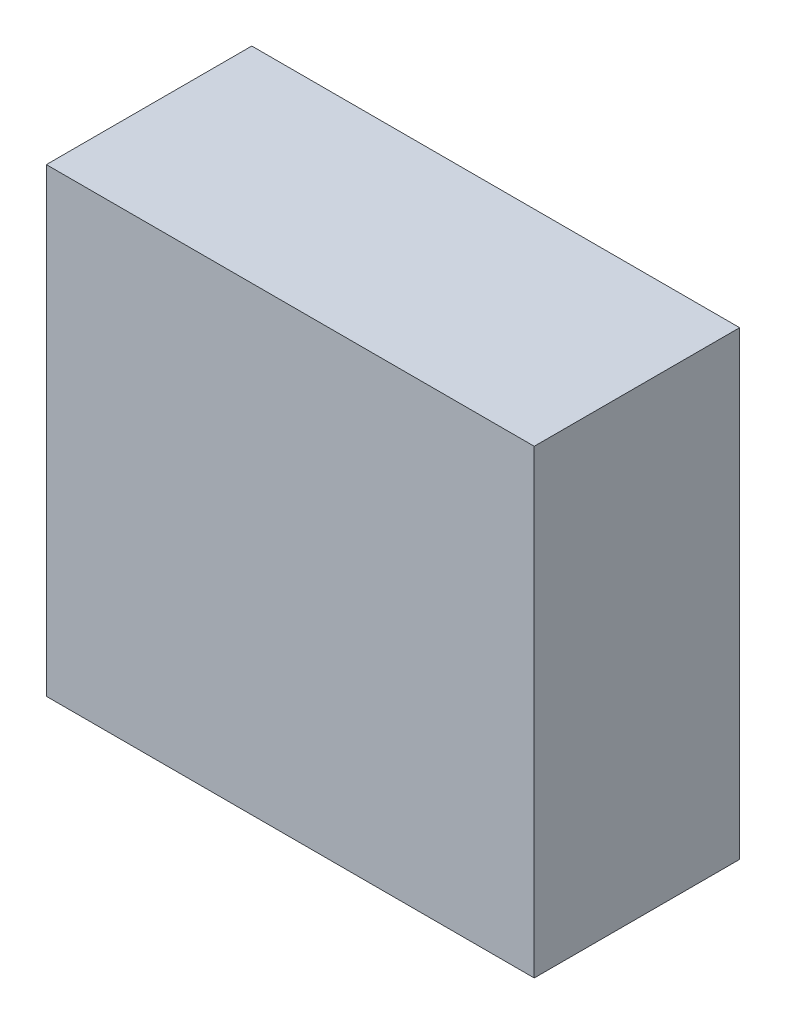
ISO-10303-21;
HEADER;
FILE_DESCRIPTION(('STEP AP214'),'2;1');
FILE_NAME('part.step','',(''),(''),'','','');
FILE_SCHEMA(('AUTOMOTIVE_DESIGN { 1 0 10303 214 1 1 1 1 }'));
ENDSEC;
DATA;
#1=APPLICATION_CONTEXT('core data for automotive mechanical design processes');
#2=APPLICATION_PROTOCOL_DEFINITION('international standard','automotive_design',2000,#1);
#3=PRODUCT_CONTEXT('',#1,'mechanical');
#4=PRODUCT('Part','Part','',(#3));
#5=PRODUCT_RELATED_PRODUCT_CATEGORY('part','',(#4));
#6=PRODUCT_DEFINITION_FORMATION('','',#4);
#7=PRODUCT_DEFINITION_CONTEXT('part definition',#1,'design');
#8=PRODUCT_DEFINITION('design','',#6,#7);
#9=PRODUCT_DEFINITION_SHAPE('','',#8);
#10=(LENGTH_UNIT() NAMED_UNIT(*) SI_UNIT(.MILLI.,.METRE.));
#11=(NAMED_UNIT(*) PLANE_ANGLE_UNIT() SI_UNIT($,.RADIAN.));
#12=(NAMED_UNIT(*) SI_UNIT($,.STERADIAN.) SOLID_ANGLE_UNIT());
#13=UNCERTAINTY_MEASURE_WITH_UNIT(LENGTH_MEASURE(1.E-05),#10,'distance_accuracy_value','');
#14=(GEOMETRIC_REPRESENTATION_CONTEXT(3) GLOBAL_UNCERTAINTY_ASSIGNED_CONTEXT((#13)) GLOBAL_UNIT_ASSIGNED_CONTEXT((#10,
#11,#12)) REPRESENTATION_CONTEXT('',''));
#15=CARTESIAN_POINT('',(0.,0.,0.));
#16=DIRECTION('',(0.,0.,1.));
#17=DIRECTION('',(1.,0.,0.));
#18=AXIS2_PLACEMENT_3D('',#15,#16,#17);
#19=CARTESIAN_POINT('',(-3.56249986,3.36250026,2.99999908));
#20=DIRECTION('',(0.,0.,1.));
#21=DIRECTION('',(1.,0.,0.));
#22=AXIS2_PLACEMENT_3D('',#19,#20,#21);
#23=PLANE('',#22);
#24=DIRECTION('',(0.,1.,0.));
#25=VECTOR('',#24,1.);
#26=CARTESIAN_POINT('',(-3.56249986,-3.36250026,2.99999908));
#27=LINE('',#26,#25);
#28=CARTESIAN_POINT('',(-3.56249986,-3.36250026,2.99999908));
#29=VERTEX_POINT('',#28);
#30=CARTESIAN_POINT('',(-3.56249986,3.36250026,2.99999908));
#31=VERTEX_POINT('',#30);
#32=EDGE_CURVE('E25',#29,#31,#27,.T.);
#33=ORIENTED_EDGE('',*,*,#32,.F.);
#34=DIRECTION('',(-1.,0.,0.));
#35=VECTOR('',#34,1.);
#36=CARTESIAN_POINT('',(3.56249986,-3.36250026,2.99999908));
#37=LINE('',#36,#35);
#38=CARTESIAN_POINT('',(3.56249986,-3.36250026,2.99999908));
#39=VERTEX_POINT('',#38);
#40=EDGE_CURVE('E102',#39,#29,#37,.T.);
#41=ORIENTED_EDGE('',*,*,#40,.F.);
#42=DIRECTION('',(0.,-1.,0.));
#43=VECTOR('',#42,1.);
#44=CARTESIAN_POINT('',(3.56249986,3.36250026,2.99999908));
#45=LINE('',#44,#43);
#46=CARTESIAN_POINT('',(3.56249986,3.36250026,2.99999908));
#47=VERTEX_POINT('',#46);
#48=EDGE_CURVE('E68',#47,#39,#45,.T.);
#49=ORIENTED_EDGE('',*,*,#48,.F.);
#50=DIRECTION('',(1.,0.,0.));
#51=VECTOR('',#50,1.);
#52=CARTESIAN_POINT('',(-3.56249986,3.36250026,2.99999908));
#53=LINE('',#52,#51);
#54=EDGE_CURVE('E94',#31,#47,#53,.T.);
#55=ORIENTED_EDGE('',*,*,#54,.F.);
#56=EDGE_LOOP('',(#33,#41,#49,#55));
#57=FACE_BOUND('',#56,.T.);
#58=ADVANCED_FACE('F17',(#57),#23,.T.);
#59=CARTESIAN_POINT('',(-3.56249986,3.36250026,0.));
#60=DIRECTION('',(0.,0.,1.));
#61=DIRECTION('',(1.,0.,0.));
#62=AXIS2_PLACEMENT_3D('',#59,#60,#61);
#63=PLANE('',#62);
#64=DIRECTION('',(1.,0.,0.));
#65=VECTOR('',#64,1.);
#66=CARTESIAN_POINT('',(-3.56249986,3.36250026,0.));
#67=LINE('',#66,#65);
#68=CARTESIAN_POINT('',(-3.56249986,3.36250026,0.));
#69=VERTEX_POINT('',#68);
#70=CARTESIAN_POINT('',(3.56249986,3.36250026,0.));
#71=VERTEX_POINT('',#70);
#72=EDGE_CURVE('E80',#69,#71,#67,.T.);
#73=ORIENTED_EDGE('',*,*,#72,.T.);
#74=DIRECTION('',(0.,-1.,0.));
#75=VECTOR('',#74,1.);
#76=CARTESIAN_POINT('',(3.56249986,3.36250026,0.));
#77=LINE('',#76,#75);
#78=CARTESIAN_POINT('',(3.56249986,-3.36250026,0.));
#79=VERTEX_POINT('',#78);
#80=EDGE_CURVE('E61',#71,#79,#77,.T.);
#81=ORIENTED_EDGE('',*,*,#80,.T.);
#82=DIRECTION('',(-1.,0.,0.));
#83=VECTOR('',#82,1.);
#84=CARTESIAN_POINT('',(3.56249986,-3.36250026,0.));
#85=LINE('',#84,#83);
#86=CARTESIAN_POINT('',(-3.56249986,-3.36250026,0.));
#87=VERTEX_POINT('',#86);
#88=EDGE_CURVE('E82',#79,#87,#85,.T.);
#89=ORIENTED_EDGE('',*,*,#88,.T.);
#90=DIRECTION('',(0.,1.,0.));
#91=VECTOR('',#90,1.);
#92=CARTESIAN_POINT('',(-3.56249986,-3.36250026,0.));
#93=LINE('',#92,#91);
#94=EDGE_CURVE('E11',#87,#69,#93,.T.);
#95=ORIENTED_EDGE('',*,*,#94,.T.);
#96=EDGE_LOOP('',(#73,#81,#89,#95));
#97=FACE_BOUND('',#96,.T.);
#98=ADVANCED_FACE('F79',(#97),#63,.F.);
#99=CARTESIAN_POINT('',(-3.56249986,-3.36250026,0.));
#100=DIRECTION('',(-1.,0.,0.));
#101=DIRECTION('',(0.,0.,1.));
#102=AXIS2_PLACEMENT_3D('',#99,#100,#101);
#103=PLANE('',#102);
#104=DIRECTION('',(0.,0.,1.));
#105=VECTOR('',#104,1.);
#106=CARTESIAN_POINT('',(-3.56249986,-3.36250026,0.));
#107=LINE('',#106,#105);
#108=EDGE_CURVE('E105',#87,#29,#107,.T.);
#109=ORIENTED_EDGE('',*,*,#108,.T.);
#110=ORIENTED_EDGE('',*,*,#32,.T.);
#111=DIRECTION('',(0.,0.,1.));
#112=VECTOR('',#111,1.);
#113=CARTESIAN_POINT('',(-3.56249986,3.36250026,0.));
#114=LINE('',#113,#112);
#115=EDGE_CURVE('E88',#69,#31,#114,.T.);
#116=ORIENTED_EDGE('',*,*,#115,.F.);
#117=ORIENTED_EDGE('',*,*,#94,.F.);
#118=EDGE_LOOP('',(#109,#110,#116,#117));
#119=FACE_BOUND('',#118,.T.);
#120=ADVANCED_FACE('F92',(#119),#103,.T.);
#121=CARTESIAN_POINT('',(3.56249986,-3.36250026,0.));
#122=DIRECTION('',(0.,-1.,0.));
#123=DIRECTION('',(0.,0.,-1.));
#124=AXIS2_PLACEMENT_3D('',#121,#122,#123);
#125=PLANE('',#124);
#126=DIRECTION('',(0.,0.,1.));
#127=VECTOR('',#126,1.);
#128=CARTESIAN_POINT('',(3.56249986,-3.36250026,0.));
#129=LINE('',#128,#127);
#130=EDGE_CURVE('E111',#79,#39,#129,.T.);
#131=ORIENTED_EDGE('',*,*,#130,.T.);
#132=ORIENTED_EDGE('',*,*,#40,.T.);
#133=ORIENTED_EDGE('',*,*,#108,.F.);
#134=ORIENTED_EDGE('',*,*,#88,.F.);
#135=EDGE_LOOP('',(#131,#132,#133,#134));
#136=FACE_BOUND('',#135,.T.);
#137=ADVANCED_FACE('F124',(#136),#125,.T.);
#138=CARTESIAN_POINT('',(3.56249986,3.36250026,0.));
#139=DIRECTION('',(1.,0.,0.));
#140=DIRECTION('',(0.,1.,0.));
#141=AXIS2_PLACEMENT_3D('',#138,#139,#140);
#142=PLANE('',#141);
#143=DIRECTION('',(0.,0.,1.));
#144=VECTOR('',#143,1.);
#145=CARTESIAN_POINT('',(3.56249986,3.36250026,0.));
#146=LINE('',#145,#144);
#147=EDGE_CURVE('E89',#71,#47,#146,.T.);
#148=ORIENTED_EDGE('',*,*,#147,.T.);
#149=ORIENTED_EDGE('',*,*,#48,.T.);
#150=ORIENTED_EDGE('',*,*,#130,.F.);
#151=ORIENTED_EDGE('',*,*,#80,.F.);
#152=EDGE_LOOP('',(#148,#149,#150,#151));
#153=FACE_BOUND('',#152,.T.);
#154=ADVANCED_FACE('F139',(#153),#142,.T.);
#155=CARTESIAN_POINT('',(-3.56249986,3.36250026,0.));
#156=DIRECTION('',(0.,1.,0.));
#157=DIRECTION('',(1.,0.,0.));
#158=AXIS2_PLACEMENT_3D('',#155,#156,#157);
#159=PLANE('',#158);
#160=ORIENTED_EDGE('',*,*,#115,.T.);
#161=ORIENTED_EDGE('',*,*,#54,.T.);
#162=ORIENTED_EDGE('',*,*,#147,.F.);
#163=ORIENTED_EDGE('',*,*,#72,.F.);
#164=EDGE_LOOP('',(#160,#161,#162,#163));
#165=FACE_BOUND('',#164,.T.);
#166=ADVANCED_FACE('F86',(#165),#159,.T.);
#167=CLOSED_SHELL('',(#58,#98,#120,#137,#154,#166));
#168=MANIFOLD_SOLID_BREP('B1',#167);
#169=ADVANCED_BREP_SHAPE_REPRESENTATION('',(#18,#168),#14);
#170=SHAPE_DEFINITION_REPRESENTATION(#9,#169);
ENDSEC;
END-ISO-10303-21;
